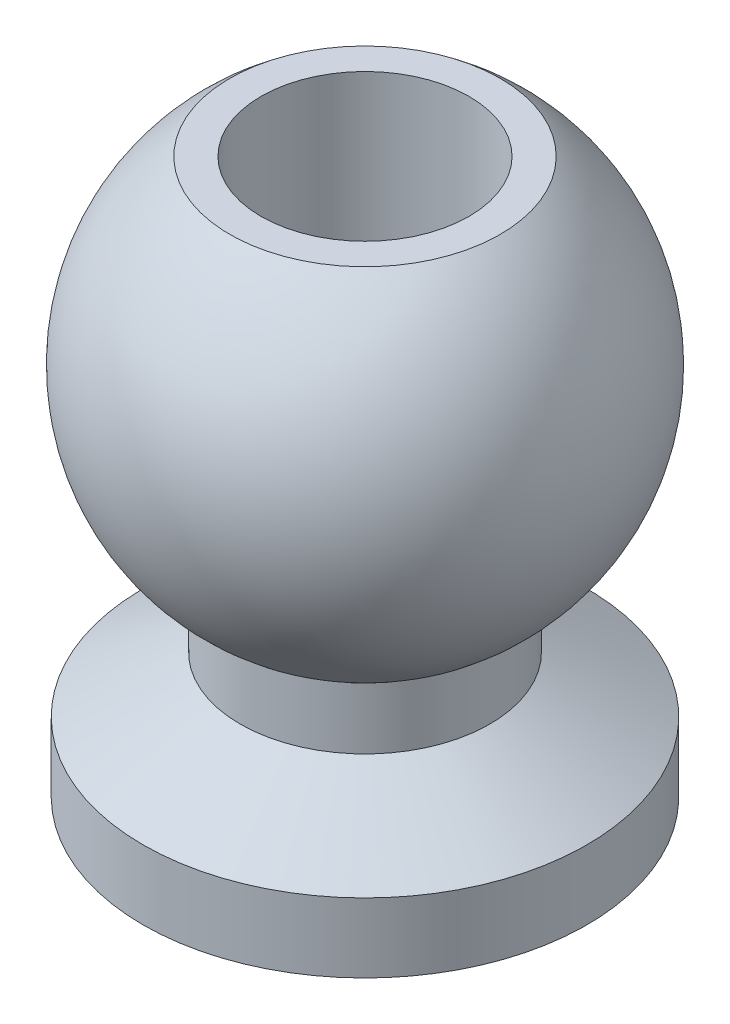
ISO-10303-21;
HEADER;
FILE_DESCRIPTION(('STEP AP214'),'2;1');
FILE_NAME('part.step','',(''),(''),'','','');
FILE_SCHEMA(('AUTOMOTIVE_DESIGN { 1 0 10303 214 1 1 1 1 }'));
ENDSEC;
DATA;
#1=APPLICATION_CONTEXT('core data for automotive mechanical design processes');
#2=APPLICATION_PROTOCOL_DEFINITION('international standard','automotive_design',2000,#1);
#3=PRODUCT_CONTEXT('',#1,'mechanical');
#4=PRODUCT('Part','Part','',(#3));
#5=PRODUCT_RELATED_PRODUCT_CATEGORY('part','',(#4));
#6=PRODUCT_DEFINITION_FORMATION('','',#4);
#7=PRODUCT_DEFINITION_CONTEXT('part definition',#1,'design');
#8=PRODUCT_DEFINITION('design','',#6,#7);
#9=PRODUCT_DEFINITION_SHAPE('','',#8);
#10=(LENGTH_UNIT() NAMED_UNIT(*) SI_UNIT(.MILLI.,.METRE.));
#11=(NAMED_UNIT(*) PLANE_ANGLE_UNIT() SI_UNIT($,.RADIAN.));
#12=(NAMED_UNIT(*) SI_UNIT($,.STERADIAN.) SOLID_ANGLE_UNIT());
#13=UNCERTAINTY_MEASURE_WITH_UNIT(LENGTH_MEASURE(1.E-05),#10,'distance_accuracy_value','');
#14=(GEOMETRIC_REPRESENTATION_CONTEXT(3) GLOBAL_UNCERTAINTY_ASSIGNED_CONTEXT((#13)) GLOBAL_UNIT_ASSIGNED_CONTEXT((#10,
#11,#12)) REPRESENTATION_CONTEXT('',''));
#15=CARTESIAN_POINT('',(0.,0.,0.));
#16=DIRECTION('',(0.,0.,1.));
#17=DIRECTION('',(1.,0.,0.));
#18=AXIS2_PLACEMENT_3D('',#15,#16,#17);
#19=CARTESIAN_POINT('',(0.,5.4,0.));
#20=DIRECTION('',(0.,1.,0.));
#21=DIRECTION('',(0.,0.,-1.));
#22=AXIS2_PLACEMENT_3D('',#19,#20,#21);
#23=SPHERICAL_SURFACE('',#22,3.25);
#24=CARTESIAN_POINT('',(0.,2.69398817445304,0.));
#25=DIRECTION('',(0.,1.,0.));
#26=DIRECTION('',(0.,0.,1.));
#27=AXIS2_PLACEMENT_3D('',#24,#25,#26);
#28=CIRCLE('',#27,1.8);
#29=CARTESIAN_POINT('',(0.,2.69398817445304,-1.8));
#30=VERTEX_POINT('',#29);
#31=EDGE_CURVE('E46',#30,#30,#28,.T.);
#32=CARTESIAN_POINT('',(0.,8.,0.));
#33=DIRECTION('',(0.,1.,0.));
#34=DIRECTION('',(0.,0.,1.));
#35=AXIS2_PLACEMENT_3D('',#32,#33,#34);
#36=CIRCLE('',#35,1.95);
#37=CARTESIAN_POINT('',(0.,8.,-1.95));
#38=VERTEX_POINT('',#37);
#39=EDGE_CURVE('E52',#38,#38,#36,.T.);
#40=CARTESIAN_POINT('',(0.,2.69398817445304,-1.8));
#41=CARTESIAN_POINT('',(0.,2.72981960360769,-1.85387127739888));
#42=CARTESIAN_POINT('',(0.,2.76726354677181,-1.90666962649685));
#43=CARTESIAN_POINT('',(0.,2.84523427780364,-2.00993875065366));
#44=CARTESIAN_POINT('',(0.,2.88576106567134,-2.06040952571249));
#45=CARTESIAN_POINT('',(0.,2.96975530279496,-2.15884178435371));
#46=CARTESIAN_POINT('',(0.,3.01322275205088,-2.20680326793609));
#47=CARTESIAN_POINT('',(0.,3.10294269769395,-2.30004639738845));
#48=CARTESIAN_POINT('',(0.,3.14919519408109,-2.34532804325844));
#49=CARTESIAN_POINT('',(0.,3.24432047831712,-2.43304991067109));
#50=CARTESIAN_POINT('',(0.,3.29319326616599,-2.47549013221375));
#51=CARTESIAN_POINT('',(0.,3.39338482301453,-2.55737785568243));
#52=CARTESIAN_POINT('',(0.,3.44470359201419,-2.59682535760845));
#53=CARTESIAN_POINT('',(0.,3.54960413588613,-2.6725869749084));
#54=CARTESIAN_POINT('',(0.,3.6031859107584,-2.70890109028233));
#55=CARTESIAN_POINT('',(0.,3.71242140671792,-2.7782664517174));
#56=CARTESIAN_POINT('',(0.,3.76807512780517,-2.81131769777854));
#57=CARTESIAN_POINT('',(0.,3.88125607266998,-2.87403946916363));
#58=CARTESIAN_POINT('',(0.,3.93878329644754,-2.90370999448758));
#59=CARTESIAN_POINT('',(0.,4.05550612173268,-2.95956452842746));
#60=CARTESIAN_POINT('',(0.,4.11470172324025,-2.98574853704339));
#61=CARTESIAN_POINT('',(0.,4.23455023038538,-3.03453667324293));
#62=CARTESIAN_POINT('',(0.,4.29520313602294,-3.05714080082654));
#63=CARTESIAN_POINT('',(0.,4.41774998144275,-3.0986885754723));
#64=CARTESIAN_POINT('',(0.,4.47964392122499,-3.11763222253445));
#65=CARTESIAN_POINT('',(0.,4.60445213981638,-3.15179148880188));
#66=CARTESIAN_POINT('',(0.,4.66736641862553,-3.16700710800716));
#67=CARTESIAN_POINT('',(0.,4.79399098192606,-3.19365606425263));
#68=CARTESIAN_POINT('',(0.,4.85770126641745,-3.20508940129283));
#69=CARTESIAN_POINT('',(0.,4.98569066942313,-3.22413302537629));
#70=CARTESIAN_POINT('',(0.,5.04996978793743,-3.23174331241955));
#71=CARTESIAN_POINT('',(0.,5.17886765903863,-3.24311370052083));
#72=CARTESIAN_POINT('',(0.,5.24348641162553,-3.24687380157886));
#73=CARTESIAN_POINT('',(0.,5.37283313988906,-3.25053041032332));
#74=CARTESIAN_POINT('',(0.,5.4375611155657,-3.25042691800976));
#75=CARTESIAN_POINT('',(0.,5.56689548956923,-3.24635670903345));
#76=CARTESIAN_POINT('',(0.,5.63150188789612,-3.2423899923707));
#77=CARTESIAN_POINT('',(0.,5.76036274026876,-3.2306074788112));
#78=CARTESIAN_POINT('',(0.,5.82461719431451,-3.22279168191446));
#79=CARTESIAN_POINT('',(0.,5.952545046121,-3.20333887666175));
#80=CARTESIAN_POINT('',(0.,6.01621844388174,-3.19170186830579));
#81=CARTESIAN_POINT('',(0.,6.14275714298439,-3.16464813419579));
#82=CARTESIAN_POINT('',(0.,6.2056224443263,-3.14923140844175));
#83=CARTESIAN_POINT('',(0.,6.33032079189092,-3.11467321093359));
#84=CARTESIAN_POINT('',(0.,6.39215383811364,-3.09553173917946));
#85=CARTESIAN_POINT('',(0.,6.51456719742992,-3.05359230237298));
#86=CARTESIAN_POINT('',(0.,6.57514751052348,-3.03079433732063));
#87=CARTESIAN_POINT('',(0.,6.69483939251481,-2.98162320463529));
#88=CARTESIAN_POINT('',(0.,6.75395096141258,-2.9552500370023));
#89=CARTESIAN_POINT('',(0.,6.87049458076533,-2.89902253773073));
#90=CARTESIAN_POINT('',(0.,6.92792663122033,-2.86916820609215));
#91=CARTESIAN_POINT('',(0.,7.04090642913864,-2.80608483104866));
#92=CARTESIAN_POINT('',(0.,7.09645417660197,-2.77285578764376));
#93=CARTESIAN_POINT('',(0.,7.20546729895597,-2.70314147121476));
#94=CARTESIAN_POINT('',(0.,7.25893267384665,-2.66665619819066));
#95=CARTESIAN_POINT('',(0.,7.3635904210981,-2.59055952770589));
#96=CARTESIAN_POINT('',(0.,7.41478279345888,-2.55094813024522));
#97=CARTESIAN_POINT('',(0.,7.51471195637834,-2.46874041697231));
#98=CARTESIAN_POINT('',(0.,7.56344874693703,-2.42614410116006));
#99=CARTESIAN_POINT('',(0.,7.65829312495876,-2.33811857194304));
#100=CARTESIAN_POINT('',(0.,7.7044007124218,-2.29268935853826));
#101=CARTESIAN_POINT('',(0.,7.79382168360231,-2.19915951664637));
#102=CARTESIAN_POINT('',(0.,7.83713506731979,-2.15105888815924));
#103=CARTESIAN_POINT('',(0.,7.92081540873911,-2.05235961074701));
#104=CARTESIAN_POINT('',(0.,7.96118236644097,-2.00176096182191));
#105=CARTESIAN_POINT('',(0.,8.,-1.95));
#106=B_SPLINE_CURVE_WITH_KNOTS('',3,(#40,#41,#42,#43,#44,#45,#46,#47,#48,#49,#50,#51,#52,#53,
#54,#55,#56,#57,#58,#59,#60,#61,#62,#63,#64,#65,#66,#67,#68,#69,#70,#71,#72,#73,#74,#75,#76,#77,
#78,#79,#80,#81,#82,#83,#84,#85,#86,#87,#88,#89,#90,#91,#92,#93,#94,#95,#96,#97,#98,#99,#100,
#101,#102,#103,#104,#105),.UNSPECIFIED.,.F.,.F.,(4,2,2,2,2,2,2,2,2,2,2,2,2,2,2,2,2,2,2,2,2,2,2,
2,2,2,2,2,2,2,2,2,4),(0.,0.194068774870301,0.388137549740602,0.582206324610903,
0.776275099481204,0.970343874351505,1.16441264922181,1.35848142409211,1.55255019896241,
1.74661897383271,1.94068774870301,2.13475652357331,2.32882529844361,2.52289407331391,
2.71696284818422,2.91103162305452,3.10510039792482,3.29916917279512,3.49323794766542,
3.68730672253572,3.88137549740602,4.07544427227632,4.26951304714662,4.46358182201693,
4.65765059688723,4.85171937175753,5.04578814662783,5.23985692149813,5.43392569636843,
5.62799447123873,5.82206324610903,6.01613202097934,6.21020079584964),.UNSPECIFIED.);
#107=EDGE_CURVE('BSEAM30',#30,#38,#106,.T.);
#108=ORIENTED_EDGE('',*,*,#31,.T.);
#109=ORIENTED_EDGE('',*,*,#39,.F.);
#110=ORIENTED_EDGE('',*,*,#107,.T.);
#111=ORIENTED_EDGE('',*,*,#107,.F.);
#112=EDGE_LOOP('',(#108,#110,#109,#111));
#113=FACE_BOUND('',#112,.T.);
#114=ADVANCED_FACE('F30',(#113),#23,.T.);
#115=CARTESIAN_POINT('',(0.,10.,0.));
#116=DIRECTION('',(0.,-1.,0.));
#117=DIRECTION('',(0.,0.,-1.));
#118=AXIS2_PLACEMENT_3D('',#115,#116,#117);
#119=CYLINDRICAL_SURFACE('',#118,1.5);
#120=CARTESIAN_POINT('',(0.,0.,0.));
#121=DIRECTION('',(0.,-1.,0.));
#122=DIRECTION('',(0.,0.,-1.));
#123=AXIS2_PLACEMENT_3D('',#120,#121,#122);
#124=CIRCLE('',#123,1.5);
#125=CARTESIAN_POINT('',(0.,0.,-1.5));
#126=VERTEX_POINT('',#125);
#127=EDGE_CURVE('E49',#126,#126,#124,.T.);
#128=ORIENTED_EDGE('',*,*,#127,.T.);
#129=EDGE_LOOP('',(#128));
#130=FACE_BOUND('',#129,.T.);
#131=CARTESIAN_POINT('',(0.,8.,0.));
#132=DIRECTION('',(0.,1.,0.));
#133=DIRECTION('',(0.,0.,1.));
#134=AXIS2_PLACEMENT_3D('',#131,#132,#133);
#135=CIRCLE('',#134,1.5);
#136=CARTESIAN_POINT('',(0.,8.,1.5));
#137=VERTEX_POINT('',#136);
#138=EDGE_CURVE('E33',#137,#137,#135,.F.);
#139=ORIENTED_EDGE('',*,*,#138,.F.);
#140=EDGE_LOOP('',(#139));
#141=FACE_BOUND('',#140,.T.);
#142=ADVANCED_FACE('F61',(#130,#141),#119,.F.);
#143=CARTESIAN_POINT('',(0.,0.,0.));
#144=DIRECTION('',(0.,1.,0.));
#145=DIRECTION('',(0.,0.,1.));
#146=AXIS2_PLACEMENT_3D('',#143,#144,#145);
#147=PLANE('',#146);
#148=ORIENTED_EDGE('',*,*,#127,.F.);
#149=EDGE_LOOP('',(#148));
#150=FACE_BOUND('',#149,.T.);
#151=CARTESIAN_POINT('',(0.,0.,0.));
#152=DIRECTION('',(0.,1.,0.));
#153=DIRECTION('',(0.,0.,1.));
#154=AXIS2_PLACEMENT_3D('',#151,#152,#153);
#155=CIRCLE('',#154,3.2);
#156=CARTESIAN_POINT('',(0.,0.,3.2));
#157=VERTEX_POINT('',#156);
#158=EDGE_CURVE('E10',#157,#157,#155,.T.);
#159=ORIENTED_EDGE('',*,*,#158,.F.);
#160=EDGE_LOOP('',(#159));
#161=FACE_BOUND('',#160,.T.);
#162=ADVANCED_FACE('F63',(#150,#161),#147,.F.);
#163=CARTESIAN_POINT('',(0.,8.65,0.));
#164=DIRECTION('',(0.,1.,0.));
#165=DIRECTION('',(0.,0.,1.));
#166=AXIS2_PLACEMENT_3D('',#163,#164,#165);
#167=CYLINDRICAL_SURFACE('',#166,3.2);
#168=CARTESIAN_POINT('',(0.,1.,0.));
#169=DIRECTION('',(0.,1.,0.));
#170=DIRECTION('',(0.,0.,1.));
#171=AXIS2_PLACEMENT_3D('',#168,#169,#170);
#172=CIRCLE('',#171,3.2);
#173=CARTESIAN_POINT('',(0.,1.,3.2));
#174=VERTEX_POINT('',#173);
#175=EDGE_CURVE('E37',#174,#174,#172,.T.);
#176=ORIENTED_EDGE('',*,*,#175,.F.);
#177=EDGE_LOOP('',(#176));
#178=FACE_BOUND('',#177,.T.);
#179=ORIENTED_EDGE('',*,*,#158,.T.);
#180=EDGE_LOOP('',(#179));
#181=FACE_BOUND('',#180,.T.);
#182=ADVANCED_FACE('F70',(#178,#181),#167,.T.);
#183=CARTESIAN_POINT('',(0.,1.,0.));
#184=DIRECTION('',(0.,-1.,0.));
#185=DIRECTION('',(0.,0.,-1.));
#186=AXIS2_PLACEMENT_3D('',#183,#184,#185);
#187=CONICAL_SURFACE('',#186,3.2,1.0471975511966);
#188=CARTESIAN_POINT('',(0.,1.80829037686546,0.));
#189=DIRECTION('',(0.,1.,0.));
#190=DIRECTION('',(0.,0.,1.));
#191=AXIS2_PLACEMENT_3D('',#188,#189,#190);
#192=CIRCLE('',#191,1.8);
#193=CARTESIAN_POINT('',(0.,1.80829037686546,1.8));
#194=VERTEX_POINT('',#193);
#195=EDGE_CURVE('E41',#194,#194,#192,.T.);
#196=ORIENTED_EDGE('',*,*,#195,.F.);
#197=EDGE_LOOP('',(#196));
#198=FACE_BOUND('',#197,.T.);
#199=ORIENTED_EDGE('',*,*,#175,.T.);
#200=EDGE_LOOP('',(#199));
#201=FACE_BOUND('',#200,.T.);
#202=ADVANCED_FACE('F78',(#198,#201),#187,.T.);
#203=CARTESIAN_POINT('',(0.,8.65,0.));
#204=DIRECTION('',(0.,1.,0.));
#205=DIRECTION('',(0.,0.,1.));
#206=AXIS2_PLACEMENT_3D('',#203,#204,#205);
#207=CYLINDRICAL_SURFACE('',#206,1.8);
#208=ORIENTED_EDGE('',*,*,#31,.F.);
#209=EDGE_LOOP('',(#208));
#210=FACE_BOUND('',#209,.T.);
#211=ORIENTED_EDGE('',*,*,#195,.T.);
#212=EDGE_LOOP('',(#211));
#213=FACE_BOUND('',#212,.T.);
#214=ADVANCED_FACE('F75',(#210,#213),#207,.T.);
#215=CARTESIAN_POINT('',(10.,8.,3.2146744435728));
#216=DIRECTION('',(0.,1.,0.));
#217=DIRECTION('',(0.,0.,1.));
#218=AXIS2_PLACEMENT_3D('',#215,#216,#217);
#219=PLANE('',#218);
#220=ORIENTED_EDGE('',*,*,#138,.T.);
#221=EDGE_LOOP('',(#220));
#222=FACE_BOUND('',#221,.T.);
#223=ORIENTED_EDGE('',*,*,#39,.T.);
#224=EDGE_LOOP('',(#223));
#225=FACE_BOUND('',#224,.T.);
#226=ADVANCED_FACE('F59',(#222,#225),#219,.T.);
#227=CLOSED_SHELL('',(#114,#142,#162,#182,#202,#214,#226));
#228=MANIFOLD_SOLID_BREP('B2',#227);
#229=ADVANCED_BREP_SHAPE_REPRESENTATION('',(#18,#228),#14);
#230=SHAPE_DEFINITION_REPRESENTATION(#9,#229);
ENDSEC;
END-ISO-10303-21;
